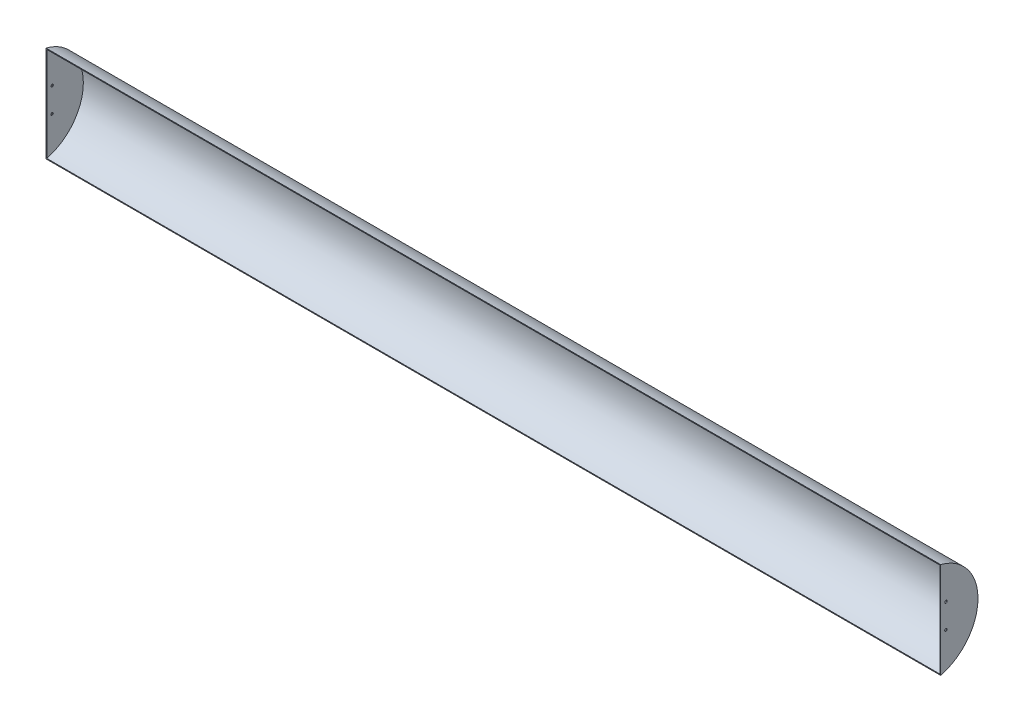
ISO-10303-21;
HEADER;
FILE_DESCRIPTION(('STEP AP214'),'2;1');
FILE_NAME('part.step','',(''),(''),'','','');
FILE_SCHEMA(('AUTOMOTIVE_DESIGN { 1 0 10303 214 1 1 1 1 }'));
ENDSEC;
DATA;
#1=APPLICATION_CONTEXT('core data for automotive mechanical design processes');
#2=APPLICATION_PROTOCOL_DEFINITION('international standard','automotive_design',2000,#1);
#3=PRODUCT_CONTEXT('',#1,'mechanical');
#4=PRODUCT('Part','Part','',(#3));
#5=PRODUCT_RELATED_PRODUCT_CATEGORY('part','',(#4));
#6=PRODUCT_DEFINITION_FORMATION('','',#4);
#7=PRODUCT_DEFINITION_CONTEXT('part definition',#1,'design');
#8=PRODUCT_DEFINITION('design','',#6,#7);
#9=PRODUCT_DEFINITION_SHAPE('','',#8);
#10=(LENGTH_UNIT() NAMED_UNIT(*) SI_UNIT(.MILLI.,.METRE.));
#11=(NAMED_UNIT(*) PLANE_ANGLE_UNIT() SI_UNIT($,.RADIAN.));
#12=(NAMED_UNIT(*) SI_UNIT($,.STERADIAN.) SOLID_ANGLE_UNIT());
#13=UNCERTAINTY_MEASURE_WITH_UNIT(LENGTH_MEASURE(1.E-05),#10,'distance_accuracy_value','');
#14=(GEOMETRIC_REPRESENTATION_CONTEXT(3) GLOBAL_UNCERTAINTY_ASSIGNED_CONTEXT((#13)) GLOBAL_UNIT_ASSIGNED_CONTEXT((#10,
#11,#12)) REPRESENTATION_CONTEXT('',''));
#15=CARTESIAN_POINT('',(0.,0.,0.));
#16=DIRECTION('',(0.,0.,1.));
#17=DIRECTION('',(1.,0.,0.));
#18=AXIS2_PLACEMENT_3D('',#15,#16,#17);
#19=CARTESIAN_POINT('',(1100.,58.0947501931113,-15.));
#20=DIRECTION('',(0.,0.,-1.));
#21=DIRECTION('',(-1.,0.,0.));
#22=AXIS2_PLACEMENT_3D('',#19,#20,#21);
#23=PLANE('',#22);
#24=DIRECTION('',(0.,-1.,0.));
#25=VECTOR('',#24,1.);
#26=CARTESIAN_POINT('',(-0.99999999999989,58.0947501931113,-15.));
#27=LINE('',#26,#25);
#28=CARTESIAN_POINT('',(-1.,59.1269819963779,-15.));
#29=VERTEX_POINT('',#28);
#30=CARTESIAN_POINT('',(-1.,-59.1269819963779,-15.));
#31=VERTEX_POINT('',#30);
#32=EDGE_CURVE('E94',#29,#31,#27,.T.);
#33=ORIENTED_EDGE('',*,*,#32,.T.);
#34=DIRECTION('',(-1.,0.,0.));
#35=VECTOR('',#34,1.);
#36=CARTESIAN_POINT('',(1101.,-59.1269819963779,-15.));
#37=LINE('',#36,#35);
#38=CARTESIAN_POINT('',(1101.,-59.1269819963779,-15.));
#39=VERTEX_POINT('',#38);
#40=EDGE_CURVE('E11',#39,#31,#37,.T.);
#41=ORIENTED_EDGE('',*,*,#40,.F.);
#42=DIRECTION('',(0.,-1.,0.));
#43=VECTOR('',#42,1.);
#44=CARTESIAN_POINT('',(1101.,58.0947501931113,-15.));
#45=LINE('',#44,#43);
#46=CARTESIAN_POINT('',(1101.,59.1269819963779,-15.));
#47=VERTEX_POINT('',#46);
#48=EDGE_CURVE('E107',#47,#39,#45,.T.);
#49=ORIENTED_EDGE('',*,*,#48,.F.);
#50=DIRECTION('',(-1.,0.,0.));
#51=VECTOR('',#50,1.);
#52=CARTESIAN_POINT('',(1101.,59.1269819963779,-15.));
#53=LINE('',#52,#51);
#54=EDGE_CURVE('E48',#47,#29,#53,.T.);
#55=ORIENTED_EDGE('',*,*,#54,.T.);
#56=EDGE_LOOP('',(#33,#41,#49,#55));
#57=FACE_BOUND('',#56,.T.);
#58=DIRECTION('',(0.,-1.,0.));
#59=VECTOR('',#58,1.);
#60=CARTESIAN_POINT('',(0.,58.0947501931113,-15.));
#61=LINE('',#60,#59);
#62=CARTESIAN_POINT('',(0.,58.0947501931113,-15.));
#63=VERTEX_POINT('',#62);
#64=CARTESIAN_POINT('',(0.,-58.0947501931113,-15.));
#65=VERTEX_POINT('',#64);
#66=EDGE_CURVE('E97',#63,#65,#61,.T.);
#67=ORIENTED_EDGE('',*,*,#66,.F.);
#68=DIRECTION('',(-1.,0.,0.));
#69=VECTOR('',#68,1.);
#70=CARTESIAN_POINT('',(1100.,58.0947501931113,-15.));
#71=LINE('',#70,#69);
#72=CARTESIAN_POINT('',(1100.,58.0947501931113,-15.));
#73=VERTEX_POINT('',#72);
#74=EDGE_CURVE('E85',#73,#63,#71,.T.);
#75=ORIENTED_EDGE('',*,*,#74,.F.);
#76=DIRECTION('',(0.,-1.,0.));
#77=VECTOR('',#76,1.);
#78=CARTESIAN_POINT('',(1100.,58.0947501931113,-15.));
#79=LINE('',#78,#77);
#80=CARTESIAN_POINT('',(1100.,-58.0947501931113,-15.));
#81=VERTEX_POINT('',#80);
#82=EDGE_CURVE('E55',#73,#81,#79,.T.);
#83=ORIENTED_EDGE('',*,*,#82,.T.);
#84=DIRECTION('',(-1.,0.,0.));
#85=VECTOR('',#84,1.);
#86=CARTESIAN_POINT('',(1100.,-58.0947501931113,-15.));
#87=LINE('',#86,#85);
#88=EDGE_CURVE('E88',#81,#65,#87,.T.);
#89=ORIENTED_EDGE('',*,*,#88,.T.);
#90=EDGE_LOOP('',(#67,#75,#83,#89));
#91=FACE_BOUND('',#90,.T.);
#92=ADVANCED_FACE('F39',(#57,#91),#23,.F.);
#93=CARTESIAN_POINT('',(1100.,0.,0.));
#94=DIRECTION('',(-1.,0.,0.));
#95=DIRECTION('',(0.,0.,1.));
#96=AXIS2_PLACEMENT_3D('',#93,#94,#95);
#97=CYLINDRICAL_SURFACE('',#96,61.);
#98=CARTESIAN_POINT('',(-0.99999999999989,0.,0.));
#99=DIRECTION('',(1.,0.,0.));
#100=DIRECTION('',(0.,0.,-1.));
#101=AXIS2_PLACEMENT_3D('',#98,#99,#100);
#102=CIRCLE('',#101,61.);
#103=EDGE_CURVE('E105',#31,#29,#102,.T.);
#104=ORIENTED_EDGE('',*,*,#103,.T.);
#105=ORIENTED_EDGE('',*,*,#54,.F.);
#106=CARTESIAN_POINT('',(1101.,0.,0.));
#107=DIRECTION('',(1.,0.,0.));
#108=DIRECTION('',(0.,0.,-1.));
#109=AXIS2_PLACEMENT_3D('',#106,#107,#108);
#110=CIRCLE('',#109,61.);
#111=EDGE_CURVE('E62',#39,#47,#110,.T.);
#112=ORIENTED_EDGE('',*,*,#111,.F.);
#113=ORIENTED_EDGE('',*,*,#40,.T.);
#114=EDGE_LOOP('',(#104,#105,#112,#113));
#115=FACE_BOUND('',#114,.T.);
#116=ADVANCED_FACE('F158',(#115),#97,.T.);
#117=CARTESIAN_POINT('',(1101.,0.,0.));
#118=DIRECTION('',(1.,0.,0.));
#119=DIRECTION('',(0.,0.,-1.));
#120=AXIS2_PLACEMENT_3D('',#117,#118,#119);
#121=PLANE('',#120);
#122=CARTESIAN_POINT('',(1101.,-13.8224529006984,-21.4958085935705));
#123=DIRECTION('',(1.,0.,0.));
#124=DIRECTION('',(0.,0.,-1.));
#125=AXIS2_PLACEMENT_3D('',#122,#123,#124);
#126=CIRCLE('',#125,1.49999730257213);
#127=CARTESIAN_POINT('',(1101.,-13.8224529006984,-22.9958058961426));
#128=VERTEX_POINT('',#127);
#129=EDGE_CURVE('E129',#128,#128,#126,.T.);
#130=ORIENTED_EDGE('',*,*,#129,.F.);
#131=EDGE_LOOP('',(#130));
#132=FACE_BOUND('',#131,.T.);
#133=CARTESIAN_POINT('',(1101.,16.1773946378629,-21.5914513256566));
#134=DIRECTION('',(1.,0.,0.));
#135=DIRECTION('',(0.,0.,-1.));
#136=AXIS2_PLACEMENT_3D('',#133,#134,#135);
#137=CIRCLE('',#136,1.49999420300046);
#138=CARTESIAN_POINT('',(1101.,16.1773946378629,-23.0914455286571));
#139=VERTEX_POINT('',#138);
#140=EDGE_CURVE('E120',#139,#139,#137,.T.);
#141=ORIENTED_EDGE('',*,*,#140,.F.);
#142=EDGE_LOOP('',(#141));
#143=FACE_BOUND('',#142,.T.);
#144=ORIENTED_EDGE('',*,*,#48,.T.);
#145=ORIENTED_EDGE('',*,*,#111,.T.);
#146=EDGE_LOOP('',(#144,#145));
#147=FACE_BOUND('',#146,.T.);
#148=ADVANCED_FACE('F164',(#132,#143,#147),#121,.T.);
#149=CARTESIAN_POINT('',(-1.,0.,0.));
#150=DIRECTION('',(1.,0.,0.));
#151=DIRECTION('',(0.,0.,-1.));
#152=AXIS2_PLACEMENT_3D('',#149,#150,#151);
#153=PLANE('',#152);
#154=CARTESIAN_POINT('',(-0.99999999999989,-13.8224529006984,-21.4958085935705));
#155=DIRECTION('',(1.,0.,0.));
#156=DIRECTION('',(0.,0.,-1.));
#157=AXIS2_PLACEMENT_3D('',#154,#155,#156);
#158=CIRCLE('',#157,1.49999730257213);
#159=CARTESIAN_POINT('',(-0.99999999999989,-13.8224529006984,-22.9958058961426));
#160=VERTEX_POINT('',#159);
#161=EDGE_CURVE('E132',#160,#160,#158,.T.);
#162=ORIENTED_EDGE('',*,*,#161,.T.);
#163=EDGE_LOOP('',(#162));
#164=FACE_BOUND('',#163,.T.);
#165=CARTESIAN_POINT('',(-0.99999999999989,16.1773946378629,-21.5914513256566));
#166=DIRECTION('',(1.,0.,0.));
#167=DIRECTION('',(0.,0.,-1.));
#168=AXIS2_PLACEMENT_3D('',#165,#166,#167);
#169=CIRCLE('',#168,1.49999420300046);
#170=CARTESIAN_POINT('',(-0.99999999999989,16.1773946378629,-23.0914455286571));
#171=VERTEX_POINT('',#170);
#172=EDGE_CURVE('E115',#171,#171,#169,.T.);
#173=ORIENTED_EDGE('',*,*,#172,.T.);
#174=EDGE_LOOP('',(#173));
#175=FACE_BOUND('',#174,.T.);
#176=ORIENTED_EDGE('',*,*,#32,.F.);
#177=ORIENTED_EDGE('',*,*,#103,.F.);
#178=EDGE_LOOP('',(#176,#177));
#179=FACE_BOUND('',#178,.T.);
#180=ADVANCED_FACE('F41',(#164,#175,#179),#153,.F.);
#181=CARTESIAN_POINT('',(1100.,0.,0.));
#182=DIRECTION('',(-1.,0.,0.));
#183=DIRECTION('',(0.,0.,1.));
#184=AXIS2_PLACEMENT_3D('',#181,#182,#183);
#185=CYLINDRICAL_SURFACE('',#184,60.);
#186=CARTESIAN_POINT('',(0.,0.,0.));
#187=DIRECTION('',(1.,0.,0.));
#188=DIRECTION('',(0.,0.,-1.));
#189=AXIS2_PLACEMENT_3D('',#186,#187,#188);
#190=CIRCLE('',#189,60.);
#191=EDGE_CURVE('E90',#65,#63,#190,.T.);
#192=ORIENTED_EDGE('',*,*,#191,.F.);
#193=ORIENTED_EDGE('',*,*,#88,.F.);
#194=CARTESIAN_POINT('',(1100.,0.,0.));
#195=DIRECTION('',(1.,0.,0.));
#196=DIRECTION('',(0.,0.,-1.));
#197=AXIS2_PLACEMENT_3D('',#194,#195,#196);
#198=CIRCLE('',#197,60.);
#199=EDGE_CURVE('E79',#81,#73,#198,.T.);
#200=ORIENTED_EDGE('',*,*,#199,.T.);
#201=ORIENTED_EDGE('',*,*,#74,.T.);
#202=EDGE_LOOP('',(#192,#193,#200,#201));
#203=FACE_BOUND('',#202,.T.);
#204=ADVANCED_FACE('F89',(#203),#185,.F.);
#205=CARTESIAN_POINT('',(1100.,0.,0.));
#206=DIRECTION('',(1.,0.,0.));
#207=DIRECTION('',(0.,0.,-1.));
#208=AXIS2_PLACEMENT_3D('',#205,#206,#207);
#209=PLANE('',#208);
#210=CARTESIAN_POINT('',(1100.,-13.8224529006984,-21.4958085935705));
#211=DIRECTION('',(1.,0.,0.));
#212=DIRECTION('',(0.,0.,-1.));
#213=AXIS2_PLACEMENT_3D('',#210,#211,#212);
#214=CIRCLE('',#213,1.49999730257213);
#215=CARTESIAN_POINT('',(1100.,-13.8224529006984,-22.9958058961426));
#216=VERTEX_POINT('',#215);
#217=EDGE_CURVE('E125',#216,#216,#214,.T.);
#218=ORIENTED_EDGE('',*,*,#217,.T.);
#219=EDGE_LOOP('',(#218));
#220=FACE_BOUND('',#219,.T.);
#221=CARTESIAN_POINT('',(1100.,16.1773946378629,-21.5914513256566));
#222=DIRECTION('',(1.,0.,0.));
#223=DIRECTION('',(0.,0.,-1.));
#224=AXIS2_PLACEMENT_3D('',#221,#222,#223);
#225=CIRCLE('',#224,1.49999420300046);
#226=CARTESIAN_POINT('',(1100.,16.1773946378629,-23.0914455286571));
#227=VERTEX_POINT('',#226);
#228=EDGE_CURVE('E100',#227,#227,#225,.T.);
#229=ORIENTED_EDGE('',*,*,#228,.T.);
#230=EDGE_LOOP('',(#229));
#231=FACE_BOUND('',#230,.T.);
#232=ORIENTED_EDGE('',*,*,#82,.F.);
#233=ORIENTED_EDGE('',*,*,#199,.F.);
#234=EDGE_LOOP('',(#232,#233));
#235=FACE_BOUND('',#234,.T.);
#236=ADVANCED_FACE('F81',(#220,#231,#235),#209,.F.);
#237=CARTESIAN_POINT('',(0.,0.,0.));
#238=DIRECTION('',(1.,0.,0.));
#239=DIRECTION('',(0.,0.,-1.));
#240=AXIS2_PLACEMENT_3D('',#237,#238,#239);
#241=PLANE('',#240);
#242=CARTESIAN_POINT('',(0.,-13.8224529006984,-21.4958085935705));
#243=DIRECTION('',(1.,0.,0.));
#244=DIRECTION('',(0.,0.,-1.));
#245=AXIS2_PLACEMENT_3D('',#242,#243,#244);
#246=CIRCLE('',#245,1.49999730257213);
#247=CARTESIAN_POINT('',(0.,-13.8224529006984,-22.9958058961426));
#248=VERTEX_POINT('',#247);
#249=EDGE_CURVE('E43',#248,#248,#246,.T.);
#250=ORIENTED_EDGE('',*,*,#249,.F.);
#251=EDGE_LOOP('',(#250));
#252=FACE_BOUND('',#251,.T.);
#253=CARTESIAN_POINT('',(0.,16.1773946378629,-21.5914513256566));
#254=DIRECTION('',(1.,0.,0.));
#255=DIRECTION('',(0.,0.,-1.));
#256=AXIS2_PLACEMENT_3D('',#253,#254,#255);
#257=CIRCLE('',#256,1.49999420300046);
#258=CARTESIAN_POINT('',(0.,16.1773946378629,-23.0914455286571));
#259=VERTEX_POINT('',#258);
#260=EDGE_CURVE('E113',#259,#259,#257,.T.);
#261=ORIENTED_EDGE('',*,*,#260,.F.);
#262=EDGE_LOOP('',(#261));
#263=FACE_BOUND('',#262,.T.);
#264=ORIENTED_EDGE('',*,*,#66,.T.);
#265=ORIENTED_EDGE('',*,*,#191,.T.);
#266=EDGE_LOOP('',(#264,#265));
#267=FACE_BOUND('',#266,.T.);
#268=ADVANCED_FACE('F142',(#252,#263,#267),#241,.T.);
#269=CARTESIAN_POINT('',(-0.99999999999989,16.1773946378629,-21.5914513256566));
#270=DIRECTION('',(1.,0.,0.));
#271=DIRECTION('',(0.,0.,-1.));
#272=AXIS2_PLACEMENT_3D('',#269,#270,#271);
#273=CYLINDRICAL_SURFACE('',#272,1.49999420300046);
#274=ORIENTED_EDGE('',*,*,#260,.T.);
#275=EDGE_LOOP('',(#274));
#276=FACE_BOUND('',#275,.T.);
#277=ORIENTED_EDGE('',*,*,#172,.F.);
#278=EDGE_LOOP('',(#277));
#279=FACE_BOUND('',#278,.T.);
#280=ADVANCED_FACE('F145',(#276,#279),#273,.F.);
#281=ORIENTED_EDGE('',*,*,#140,.T.);
#282=EDGE_LOOP('',(#281));
#283=FACE_BOUND('',#282,.T.);
#284=ORIENTED_EDGE('',*,*,#228,.F.);
#285=EDGE_LOOP('',(#284));
#286=FACE_BOUND('',#285,.T.);
#287=ADVANCED_FACE('F152',(#283,#286),#273,.F.);
#288=CARTESIAN_POINT('',(-0.99999999999989,-13.8224529006984,-21.4958085935705));
#289=DIRECTION('',(1.,0.,0.));
#290=DIRECTION('',(0.,0.,-1.));
#291=AXIS2_PLACEMENT_3D('',#288,#289,#290);
#292=CYLINDRICAL_SURFACE('',#291,1.49999730257213);
#293=ORIENTED_EDGE('',*,*,#249,.T.);
#294=EDGE_LOOP('',(#293));
#295=FACE_BOUND('',#294,.T.);
#296=ORIENTED_EDGE('',*,*,#161,.F.);
#297=EDGE_LOOP('',(#296));
#298=FACE_BOUND('',#297,.T.);
#299=ADVANCED_FACE('F139',(#295,#298),#292,.F.);
#300=ORIENTED_EDGE('',*,*,#129,.T.);
#301=EDGE_LOOP('',(#300));
#302=FACE_BOUND('',#301,.T.);
#303=ORIENTED_EDGE('',*,*,#217,.F.);
#304=EDGE_LOOP('',(#303));
#305=FACE_BOUND('',#304,.T.);
#306=ADVANCED_FACE('F187',(#302,#305),#292,.F.);
#307=CLOSED_SHELL('',(#92,#116,#148,#180,#204,#236,#268,#280,#287,#299,#306));
#308=MANIFOLD_SOLID_BREP('B2',#307);
#309=ADVANCED_BREP_SHAPE_REPRESENTATION('',(#18,#308),#14);
#310=SHAPE_DEFINITION_REPRESENTATION(#9,#309);
ENDSEC;
END-ISO-10303-21;
